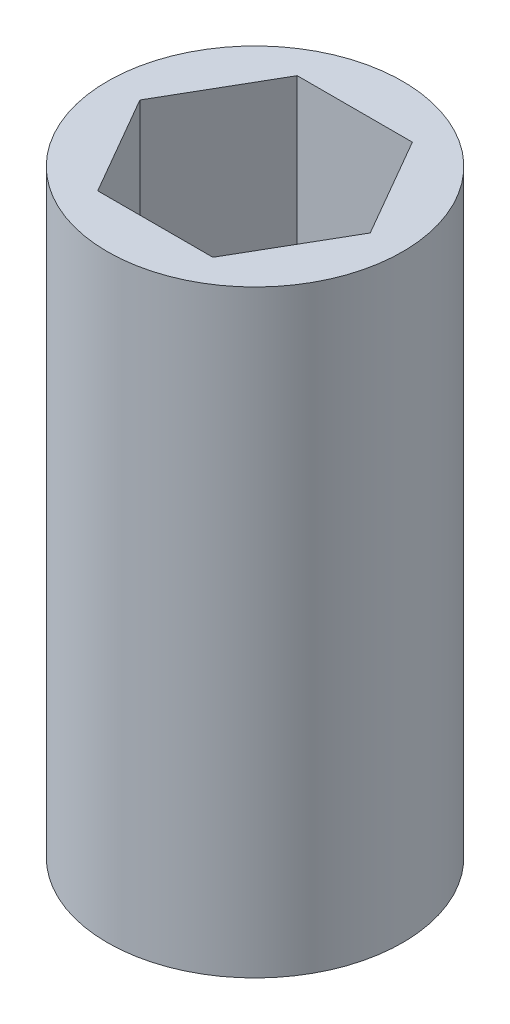
ISO-10303-21;
HEADER;
FILE_DESCRIPTION(('STEP AP214'),'2;1');
FILE_NAME('part.step','',(''),(''),'','','');
FILE_SCHEMA(('AUTOMOTIVE_DESIGN { 1 0 10303 214 1 1 1 1 }'));
ENDSEC;
DATA;
#1=APPLICATION_CONTEXT('core data for automotive mechanical design processes');
#2=APPLICATION_PROTOCOL_DEFINITION('international standard','automotive_design',2000,#1);
#3=PRODUCT_CONTEXT('',#1,'mechanical');
#4=PRODUCT('Part','Part','',(#3));
#5=PRODUCT_RELATED_PRODUCT_CATEGORY('part','',(#4));
#6=PRODUCT_DEFINITION_FORMATION('','',#4);
#7=PRODUCT_DEFINITION_CONTEXT('part definition',#1,'design');
#8=PRODUCT_DEFINITION('design','',#6,#7);
#9=PRODUCT_DEFINITION_SHAPE('','',#8);
#10=(LENGTH_UNIT() NAMED_UNIT(*) SI_UNIT(.MILLI.,.METRE.));
#11=(NAMED_UNIT(*) PLANE_ANGLE_UNIT() SI_UNIT($,.RADIAN.));
#12=(NAMED_UNIT(*) SI_UNIT($,.STERADIAN.) SOLID_ANGLE_UNIT());
#13=UNCERTAINTY_MEASURE_WITH_UNIT(LENGTH_MEASURE(1.E-05),#10,'distance_accuracy_value','');
#14=(GEOMETRIC_REPRESENTATION_CONTEXT(3) GLOBAL_UNCERTAINTY_ASSIGNED_CONTEXT((#13)) GLOBAL_UNIT_ASSIGNED_CONTEXT((#10,
#11,#12)) REPRESENTATION_CONTEXT('',''));
#15=CARTESIAN_POINT('',(0.,0.,0.));
#16=DIRECTION('',(0.,0.,1.));
#17=DIRECTION('',(1.,0.,0.));
#18=AXIS2_PLACEMENT_3D('',#15,#16,#17);
#19=CARTESIAN_POINT('',(0.,14.478,0.));
#20=DIRECTION('',(0.,1.,0.));
#21=DIRECTION('',(0.,0.,1.));
#22=AXIS2_PLACEMENT_3D('',#19,#20,#21);
#23=PLANE('',#22);
#24=CARTESIAN_POINT('',(0.,14.478,0.));
#25=DIRECTION('',(0.,1.,0.));
#26=DIRECTION('',(0.,0.,1.));
#27=AXIS2_PLACEMENT_3D('',#24,#25,#26);
#28=CIRCLE('',#27,7.14375);
#29=CARTESIAN_POINT('',(0.,14.478,7.14375));
#30=VERTEX_POINT('',#29);
#31=EDGE_CURVE('E11',#30,#30,#28,.T.);
#32=ORIENTED_EDGE('',*,*,#31,.T.);
#33=EDGE_LOOP('',(#32));
#34=FACE_BOUND('',#33,.T.);
#35=DIRECTION('',(0.5,0.,-0.866025403784439));
#36=VECTOR('',#35,1.);
#37=CARTESIAN_POINT('',(2.78629239910914,14.478,4.826));
#38=LINE('',#37,#36);
#39=CARTESIAN_POINT('',(2.78629239910914,14.478,4.826));
#40=VERTEX_POINT('',#39);
#41=CARTESIAN_POINT('',(5.57258479821827,14.478,0.));
#42=VERTEX_POINT('',#41);
#43=EDGE_CURVE('E95',#40,#42,#38,.T.);
#44=ORIENTED_EDGE('',*,*,#43,.F.);
#45=DIRECTION('',(1.,0.,0.));
#46=VECTOR('',#45,1.);
#47=CARTESIAN_POINT('',(-2.78629239910914,14.478,4.826));
#48=LINE('',#47,#46);
#49=CARTESIAN_POINT('',(-2.78629239910914,14.478,4.826));
#50=VERTEX_POINT('',#49);
#51=EDGE_CURVE('E87',#50,#40,#48,.T.);
#52=ORIENTED_EDGE('',*,*,#51,.F.);
#53=DIRECTION('',(0.5,0.,0.866025403784439));
#54=VECTOR('',#53,1.);
#55=CARTESIAN_POINT('',(-5.57258479821827,14.478,0.));
#56=LINE('',#55,#54);
#57=CARTESIAN_POINT('',(-5.57258479821827,14.478,0.));
#58=VERTEX_POINT('',#57);
#59=EDGE_CURVE('E115',#58,#50,#56,.T.);
#60=ORIENTED_EDGE('',*,*,#59,.F.);
#61=DIRECTION('',(-0.5,0.,0.866025403784439));
#62=VECTOR('',#61,1.);
#63=CARTESIAN_POINT('',(-2.78629239910914,14.478,-4.826));
#64=LINE('',#63,#62);
#65=CARTESIAN_POINT('',(-2.78629239910914,14.478,-4.826));
#66=VERTEX_POINT('',#65);
#67=EDGE_CURVE('E113',#66,#58,#64,.T.);
#68=ORIENTED_EDGE('',*,*,#67,.F.);
#69=DIRECTION('',(-1.,0.,0.));
#70=VECTOR('',#69,1.);
#71=CARTESIAN_POINT('',(2.78629239910914,14.478,-4.826));
#72=LINE('',#71,#70);
#73=CARTESIAN_POINT('',(2.78629239910914,14.478,-4.826));
#74=VERTEX_POINT('',#73);
#75=EDGE_CURVE('E109',#74,#66,#72,.T.);
#76=ORIENTED_EDGE('',*,*,#75,.F.);
#77=DIRECTION('',(-0.5,0.,-0.866025403784439));
#78=VECTOR('',#77,1.);
#79=CARTESIAN_POINT('',(5.57258479821827,14.478,0.));
#80=LINE('',#79,#78);
#81=EDGE_CURVE('E107',#42,#74,#80,.T.);
#82=ORIENTED_EDGE('',*,*,#81,.F.);
#83=EDGE_LOOP('',(#44,#52,#60,#68,#76,#82));
#84=FACE_BOUND('',#83,.T.);
#85=ADVANCED_FACE('F34',(#34,#84),#23,.T.);
#86=CARTESIAN_POINT('',(0.,-14.478,0.));
#87=DIRECTION('',(0.,1.,0.));
#88=DIRECTION('',(0.,0.,1.));
#89=AXIS2_PLACEMENT_3D('',#86,#87,#88);
#90=PLANE('',#89);
#91=CARTESIAN_POINT('',(0.,-14.478,0.));
#92=DIRECTION('',(0.,1.,0.));
#93=DIRECTION('',(0.,0.,1.));
#94=AXIS2_PLACEMENT_3D('',#91,#92,#93);
#95=CIRCLE('',#94,7.14375);
#96=CARTESIAN_POINT('',(0.,-14.478,7.14375));
#97=VERTEX_POINT('',#96);
#98=EDGE_CURVE('E38',#97,#97,#95,.T.);
#99=ORIENTED_EDGE('',*,*,#98,.F.);
#100=EDGE_LOOP('',(#99));
#101=FACE_BOUND('',#100,.T.);
#102=DIRECTION('',(1.,0.,0.));
#103=VECTOR('',#102,1.);
#104=CARTESIAN_POINT('',(-2.78629239910914,-14.478,4.826));
#105=LINE('',#104,#103);
#106=CARTESIAN_POINT('',(-2.78629239910914,-14.478,4.826));
#107=VERTEX_POINT('',#106);
#108=CARTESIAN_POINT('',(2.78629239910914,-14.478,4.826));
#109=VERTEX_POINT('',#108);
#110=EDGE_CURVE('E57',#107,#109,#105,.T.);
#111=ORIENTED_EDGE('',*,*,#110,.T.);
#112=DIRECTION('',(0.5,0.,-0.866025403784439));
#113=VECTOR('',#112,1.);
#114=CARTESIAN_POINT('',(2.78629239910914,-14.478,4.826));
#115=LINE('',#114,#113);
#116=CARTESIAN_POINT('',(5.57258479821827,-14.478,0.));
#117=VERTEX_POINT('',#116);
#118=EDGE_CURVE('E102',#109,#117,#115,.T.);
#119=ORIENTED_EDGE('',*,*,#118,.T.);
#120=DIRECTION('',(-0.5,0.,-0.866025403784439));
#121=VECTOR('',#120,1.);
#122=CARTESIAN_POINT('',(5.57258479821827,-14.478,0.));
#123=LINE('',#122,#121);
#124=CARTESIAN_POINT('',(2.78629239910914,-14.478,-4.826));
#125=VERTEX_POINT('',#124);
#126=EDGE_CURVE('E119',#117,#125,#123,.T.);
#127=ORIENTED_EDGE('',*,*,#126,.T.);
#128=DIRECTION('',(-1.,0.,0.));
#129=VECTOR('',#128,1.);
#130=CARTESIAN_POINT('',(2.78629239910914,-14.478,-4.826));
#131=LINE('',#130,#129);
#132=CARTESIAN_POINT('',(-2.78629239910914,-14.478,-4.826));
#133=VERTEX_POINT('',#132);
#134=EDGE_CURVE('E122',#125,#133,#131,.T.);
#135=ORIENTED_EDGE('',*,*,#134,.T.);
#136=DIRECTION('',(-0.5,0.,0.866025403784439));
#137=VECTOR('',#136,1.);
#138=CARTESIAN_POINT('',(-2.78629239910914,-14.478,-4.826));
#139=LINE('',#138,#137);
#140=CARTESIAN_POINT('',(-5.57258479821827,-14.478,0.));
#141=VERTEX_POINT('',#140);
#142=EDGE_CURVE('E125',#133,#141,#139,.T.);
#143=ORIENTED_EDGE('',*,*,#142,.T.);
#144=DIRECTION('',(0.5,0.,0.866025403784439));
#145=VECTOR('',#144,1.);
#146=CARTESIAN_POINT('',(-5.57258479821827,-14.478,0.));
#147=LINE('',#146,#145);
#148=EDGE_CURVE('E96',#141,#107,#147,.T.);
#149=ORIENTED_EDGE('',*,*,#148,.T.);
#150=EDGE_LOOP('',(#111,#119,#127,#135,#143,#149));
#151=FACE_BOUND('',#150,.T.);
#152=ADVANCED_FACE('F142',(#101,#151),#90,.F.);
#153=CARTESIAN_POINT('',(0.,14.478,0.));
#154=DIRECTION('',(0.,-1.,0.));
#155=DIRECTION('',(0.,0.,-1.));
#156=AXIS2_PLACEMENT_3D('',#153,#154,#155);
#157=CYLINDRICAL_SURFACE('',#156,7.14375);
#158=ORIENTED_EDGE('',*,*,#31,.F.);
#159=EDGE_LOOP('',(#158));
#160=FACE_BOUND('',#159,.T.);
#161=ORIENTED_EDGE('',*,*,#98,.T.);
#162=EDGE_LOOP('',(#161));
#163=FACE_BOUND('',#162,.T.);
#164=ADVANCED_FACE('F36',(#160,#163),#157,.T.);
#165=CARTESIAN_POINT('',(-2.78629239910914,14.478,4.826));
#166=DIRECTION('',(0.,0.,-1.));
#167=DIRECTION('',(-1.,0.,0.));
#168=AXIS2_PLACEMENT_3D('',#165,#166,#167);
#169=PLANE('',#168);
#170=ORIENTED_EDGE('',*,*,#110,.F.);
#171=DIRECTION('',(0.,-1.,0.));
#172=VECTOR('',#171,1.);
#173=CARTESIAN_POINT('',(-2.78629239910914,14.478,4.826));
#174=LINE('',#173,#172);
#175=EDGE_CURVE('E91',#50,#107,#174,.T.);
#176=ORIENTED_EDGE('',*,*,#175,.F.);
#177=ORIENTED_EDGE('',*,*,#51,.T.);
#178=DIRECTION('',(0.,-1.,0.));
#179=VECTOR('',#178,1.);
#180=CARTESIAN_POINT('',(2.78629239910914,14.478,4.826));
#181=LINE('',#180,#179);
#182=EDGE_CURVE('E90',#40,#109,#181,.T.);
#183=ORIENTED_EDGE('',*,*,#182,.T.);
#184=EDGE_LOOP('',(#170,#176,#177,#183));
#185=FACE_BOUND('',#184,.T.);
#186=ADVANCED_FACE('F89',(#185),#169,.T.);
#187=CARTESIAN_POINT('',(2.78629239910914,14.478,4.826));
#188=DIRECTION('',(-0.866025403784439,0.,-0.5));
#189=DIRECTION('',(-0.5,0.,0.866025403784439));
#190=AXIS2_PLACEMENT_3D('',#187,#188,#189);
#191=PLANE('',#190);
#192=ORIENTED_EDGE('',*,*,#118,.F.);
#193=ORIENTED_EDGE('',*,*,#182,.F.);
#194=ORIENTED_EDGE('',*,*,#43,.T.);
#195=DIRECTION('',(0.,-1.,0.));
#196=VECTOR('',#195,1.);
#197=CARTESIAN_POINT('',(5.57258479821827,14.478,0.));
#198=LINE('',#197,#196);
#199=EDGE_CURVE('E103',#42,#117,#198,.T.);
#200=ORIENTED_EDGE('',*,*,#199,.T.);
#201=EDGE_LOOP('',(#192,#193,#194,#200));
#202=FACE_BOUND('',#201,.T.);
#203=ADVANCED_FACE('F99',(#202),#191,.T.);
#204=CARTESIAN_POINT('',(5.57258479821827,14.478,0.));
#205=DIRECTION('',(-0.866025403784439,0.,0.5));
#206=DIRECTION('',(0.5,0.,0.866025403784439));
#207=AXIS2_PLACEMENT_3D('',#204,#205,#206);
#208=PLANE('',#207);
#209=ORIENTED_EDGE('',*,*,#126,.F.);
#210=ORIENTED_EDGE('',*,*,#199,.F.);
#211=ORIENTED_EDGE('',*,*,#81,.T.);
#212=DIRECTION('',(0.,-1.,0.));
#213=VECTOR('',#212,1.);
#214=CARTESIAN_POINT('',(2.78629239910914,14.478,-4.826));
#215=LINE('',#214,#213);
#216=EDGE_CURVE('E134',#74,#125,#215,.T.);
#217=ORIENTED_EDGE('',*,*,#216,.T.);
#218=EDGE_LOOP('',(#209,#210,#211,#217));
#219=FACE_BOUND('',#218,.T.);
#220=ADVANCED_FACE('F138',(#219),#208,.T.);
#221=CARTESIAN_POINT('',(2.78629239910914,14.478,-4.826));
#222=DIRECTION('',(0.,0.,1.));
#223=DIRECTION('',(1.,0.,0.));
#224=AXIS2_PLACEMENT_3D('',#221,#222,#223);
#225=PLANE('',#224);
#226=ORIENTED_EDGE('',*,*,#134,.F.);
#227=ORIENTED_EDGE('',*,*,#216,.F.);
#228=ORIENTED_EDGE('',*,*,#75,.T.);
#229=DIRECTION('',(0.,-1.,0.));
#230=VECTOR('',#229,1.);
#231=CARTESIAN_POINT('',(-2.78629239910914,14.478,-4.826));
#232=LINE('',#231,#230);
#233=EDGE_CURVE('E132',#66,#133,#232,.T.);
#234=ORIENTED_EDGE('',*,*,#233,.T.);
#235=EDGE_LOOP('',(#226,#227,#228,#234));
#236=FACE_BOUND('',#235,.T.);
#237=ADVANCED_FACE('F150',(#236),#225,.T.);
#238=CARTESIAN_POINT('',(-2.78629239910914,14.478,-4.826));
#239=DIRECTION('',(0.866025403784439,0.,0.5));
#240=DIRECTION('',(0.5,0.,-0.866025403784439));
#241=AXIS2_PLACEMENT_3D('',#238,#239,#240);
#242=PLANE('',#241);
#243=ORIENTED_EDGE('',*,*,#142,.F.);
#244=ORIENTED_EDGE('',*,*,#233,.F.);
#245=ORIENTED_EDGE('',*,*,#67,.T.);
#246=DIRECTION('',(0.,-1.,0.));
#247=VECTOR('',#246,1.);
#248=CARTESIAN_POINT('',(-5.57258479821827,14.478,0.));
#249=LINE('',#248,#247);
#250=EDGE_CURVE('E49',#58,#141,#249,.T.);
#251=ORIENTED_EDGE('',*,*,#250,.T.);
#252=EDGE_LOOP('',(#243,#244,#245,#251));
#253=FACE_BOUND('',#252,.T.);
#254=ADVANCED_FACE('F148',(#253),#242,.T.);
#255=CARTESIAN_POINT('',(-5.57258479821827,14.478,0.));
#256=DIRECTION('',(0.866025403784439,0.,-0.5));
#257=DIRECTION('',(-0.5,0.,-0.866025403784439));
#258=AXIS2_PLACEMENT_3D('',#255,#256,#257);
#259=PLANE('',#258);
#260=ORIENTED_EDGE('',*,*,#148,.F.);
#261=ORIENTED_EDGE('',*,*,#250,.F.);
#262=ORIENTED_EDGE('',*,*,#59,.T.);
#263=ORIENTED_EDGE('',*,*,#175,.T.);
#264=EDGE_LOOP('',(#260,#261,#262,#263));
#265=FACE_BOUND('',#264,.T.);
#266=ADVANCED_FACE('F144',(#265),#259,.T.);
#267=CLOSED_SHELL('',(#85,#152,#164,#186,#203,#220,#237,#254,#266));
#268=MANIFOLD_SOLID_BREP('B2',#267);
#269=ADVANCED_BREP_SHAPE_REPRESENTATION('',(#18,#268),#14);
#270=SHAPE_DEFINITION_REPRESENTATION(#9,#269);
ENDSEC;
END-ISO-10303-21;
